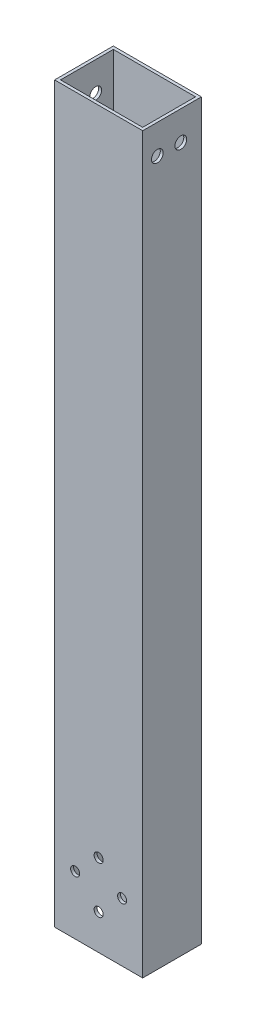
ISO-10303-21;
HEADER;
FILE_DESCRIPTION(('STEP AP214'),'2;1');
FILE_NAME('part.step','',(''),(''),'','','');
FILE_SCHEMA(('AUTOMOTIVE_DESIGN { 1 0 10303 214 1 1 1 1 }'));
ENDSEC;
DATA;
#1=APPLICATION_CONTEXT('core data for automotive mechanical design processes');
#2=APPLICATION_PROTOCOL_DEFINITION('international standard','automotive_design',2000,#1);
#3=PRODUCT_CONTEXT('',#1,'mechanical');
#4=PRODUCT('Part','Part','',(#3));
#5=PRODUCT_RELATED_PRODUCT_CATEGORY('part','',(#4));
#6=PRODUCT_DEFINITION_FORMATION('','',#4);
#7=PRODUCT_DEFINITION_CONTEXT('part definition',#1,'design');
#8=PRODUCT_DEFINITION('design','',#6,#7);
#9=PRODUCT_DEFINITION_SHAPE('','',#8);
#10=(LENGTH_UNIT() NAMED_UNIT(*) SI_UNIT(.MILLI.,.METRE.));
#11=(NAMED_UNIT(*) PLANE_ANGLE_UNIT() SI_UNIT($,.RADIAN.));
#12=(NAMED_UNIT(*) SI_UNIT($,.STERADIAN.) SOLID_ANGLE_UNIT());
#13=UNCERTAINTY_MEASURE_WITH_UNIT(LENGTH_MEASURE(1.E-05),#10,'distance_accuracy_value','');
#14=(GEOMETRIC_REPRESENTATION_CONTEXT(3) GLOBAL_UNCERTAINTY_ASSIGNED_CONTEXT((#13)) GLOBAL_UNIT_ASSIGNED_CONTEXT((#10,
#11,#12)) REPRESENTATION_CONTEXT('',''));
#15=CARTESIAN_POINT('',(0.,0.,0.));
#16=DIRECTION('',(0.,0.,1.));
#17=DIRECTION('',(1.,0.,0.));
#18=AXIS2_PLACEMENT_3D('',#15,#16,#17);
#19=CARTESIAN_POINT('',(0.,250.,0.));
#20=DIRECTION('',(0.,-1.,0.));
#21=DIRECTION('',(0.,0.,-1.));
#22=AXIS2_PLACEMENT_3D('',#19,#20,#21);
#23=PLANE('',#22);
#24=DIRECTION('',(0.,0.,-1.));
#25=VECTOR('',#24,1.);
#26=CARTESIAN_POINT('',(15.,250.,10.));
#27=LINE('',#26,#25);
#28=CARTESIAN_POINT('',(15.,250.,10.));
#29=VERTEX_POINT('',#28);
#30=CARTESIAN_POINT('',(15.,250.,-10.));
#31=VERTEX_POINT('',#30);
#32=EDGE_CURVE('E139',#29,#31,#27,.T.);
#33=ORIENTED_EDGE('',*,*,#32,.T.);
#34=DIRECTION('',(-1.,0.,0.));
#35=VECTOR('',#34,1.);
#36=CARTESIAN_POINT('',(-15.,250.,-10.));
#37=LINE('',#36,#35);
#38=CARTESIAN_POINT('',(-15.,250.,-10.));
#39=VERTEX_POINT('',#38);
#40=EDGE_CURVE('E142',#31,#39,#37,.T.);
#41=ORIENTED_EDGE('',*,*,#40,.T.);
#42=DIRECTION('',(0.,0.,1.));
#43=VECTOR('',#42,1.);
#44=CARTESIAN_POINT('',(-15.,250.,10.));
#45=LINE('',#44,#43);
#46=CARTESIAN_POINT('',(-15.,250.,10.));
#47=VERTEX_POINT('',#46);
#48=EDGE_CURVE('E145',#39,#47,#45,.T.);
#49=ORIENTED_EDGE('',*,*,#48,.T.);
#50=DIRECTION('',(1.,0.,0.));
#51=VECTOR('',#50,1.);
#52=CARTESIAN_POINT('',(-15.,250.,10.));
#53=LINE('',#52,#51);
#54=EDGE_CURVE('E147',#47,#29,#53,.T.);
#55=ORIENTED_EDGE('',*,*,#54,.T.);
#56=EDGE_LOOP('',(#33,#41,#49,#55));
#57=FACE_BOUND('',#56,.T.);
#58=DIRECTION('',(0.,0.,-1.));
#59=VECTOR('',#58,1.);
#60=CARTESIAN_POINT('',(14.,250.,9.00000000000001));
#61=LINE('',#60,#59);
#62=CARTESIAN_POINT('',(14.,250.,9.00000000000001));
#63=VERTEX_POINT('',#62);
#64=CARTESIAN_POINT('',(14.,250.,-9.00000000000001));
#65=VERTEX_POINT('',#64);
#66=EDGE_CURVE('E101',#63,#65,#61,.T.);
#67=ORIENTED_EDGE('',*,*,#66,.F.);
#68=DIRECTION('',(1.,0.,0.));
#69=VECTOR('',#68,1.);
#70=CARTESIAN_POINT('',(-14.,250.,9.00000000000001));
#71=LINE('',#70,#69);
#72=CARTESIAN_POINT('',(-14.,250.,9.00000000000001));
#73=VERTEX_POINT('',#72);
#74=EDGE_CURVE('E123',#73,#63,#71,.T.);
#75=ORIENTED_EDGE('',*,*,#74,.F.);
#76=DIRECTION('',(0.,0.,1.));
#77=VECTOR('',#76,1.);
#78=CARTESIAN_POINT('',(-14.,250.,9.00000000000001));
#79=LINE('',#78,#77);
#80=CARTESIAN_POINT('',(-14.,250.,-9.));
#81=VERTEX_POINT('',#80);
#82=EDGE_CURVE('E121',#81,#73,#79,.T.);
#83=ORIENTED_EDGE('',*,*,#82,.F.);
#84=DIRECTION('',(-1.,0.,0.));
#85=VECTOR('',#84,1.);
#86=CARTESIAN_POINT('',(-14.,250.,-9.));
#87=LINE('',#86,#85);
#88=EDGE_CURVE('E109',#65,#81,#87,.T.);
#89=ORIENTED_EDGE('',*,*,#88,.F.);
#90=EDGE_LOOP('',(#67,#75,#83,#89));
#91=FACE_BOUND('',#90,.T.);
#92=ADVANCED_FACE('F34',(#57,#91),#23,.F.);
#93=CARTESIAN_POINT('',(0.,0.,0.));
#94=DIRECTION('',(0.,-1.,0.));
#95=DIRECTION('',(0.,0.,-1.));
#96=AXIS2_PLACEMENT_3D('',#93,#94,#95);
#97=PLANE('',#96);
#98=DIRECTION('',(0.,0.,-1.));
#99=VECTOR('',#98,1.);
#100=CARTESIAN_POINT('',(15.,0.,10.));
#101=LINE('',#100,#99);
#102=CARTESIAN_POINT('',(15.,0.,10.));
#103=VERTEX_POINT('',#102);
#104=CARTESIAN_POINT('',(15.,0.,-10.));
#105=VERTEX_POINT('',#104);
#106=EDGE_CURVE('E117',#103,#105,#101,.T.);
#107=ORIENTED_EDGE('',*,*,#106,.F.);
#108=DIRECTION('',(1.,0.,0.));
#109=VECTOR('',#108,1.);
#110=CARTESIAN_POINT('',(-15.,0.,10.));
#111=LINE('',#110,#109);
#112=CARTESIAN_POINT('',(-15.,0.,10.));
#113=VERTEX_POINT('',#112);
#114=EDGE_CURVE('E143',#113,#103,#111,.T.);
#115=ORIENTED_EDGE('',*,*,#114,.F.);
#116=DIRECTION('',(0.,0.,1.));
#117=VECTOR('',#116,1.);
#118=CARTESIAN_POINT('',(-15.,0.,10.));
#119=LINE('',#118,#117);
#120=CARTESIAN_POINT('',(-15.,0.,-10.));
#121=VERTEX_POINT('',#120);
#122=EDGE_CURVE('E154',#121,#113,#119,.T.);
#123=ORIENTED_EDGE('',*,*,#122,.F.);
#124=DIRECTION('',(-1.,0.,0.));
#125=VECTOR('',#124,1.);
#126=CARTESIAN_POINT('',(-15.,0.,-10.));
#127=LINE('',#126,#125);
#128=EDGE_CURVE('E152',#105,#121,#127,.T.);
#129=ORIENTED_EDGE('',*,*,#128,.F.);
#130=EDGE_LOOP('',(#107,#115,#123,#129));
#131=FACE_BOUND('',#130,.T.);
#132=DIRECTION('',(1.,0.,0.));
#133=VECTOR('',#132,1.);
#134=CARTESIAN_POINT('',(-14.,0.,9.00000000000001));
#135=LINE('',#134,#133);
#136=CARTESIAN_POINT('',(-14.,0.,9.00000000000001));
#137=VERTEX_POINT('',#136);
#138=CARTESIAN_POINT('',(14.,0.,9.00000000000001));
#139=VERTEX_POINT('',#138);
#140=EDGE_CURVE('E110',#137,#139,#135,.T.);
#141=ORIENTED_EDGE('',*,*,#140,.T.);
#142=DIRECTION('',(0.,0.,-1.));
#143=VECTOR('',#142,1.);
#144=CARTESIAN_POINT('',(14.,0.,9.00000000000001));
#145=LINE('',#144,#143);
#146=CARTESIAN_POINT('',(14.,0.,-9.00000000000001));
#147=VERTEX_POINT('',#146);
#148=EDGE_CURVE('E59',#139,#147,#145,.T.);
#149=ORIENTED_EDGE('',*,*,#148,.T.);
#150=DIRECTION('',(-1.,0.,0.));
#151=VECTOR('',#150,1.);
#152=CARTESIAN_POINT('',(-14.,0.,-9.));
#153=LINE('',#152,#151);
#154=CARTESIAN_POINT('',(-14.,0.,-9.));
#155=VERTEX_POINT('',#154);
#156=EDGE_CURVE('E116',#147,#155,#153,.T.);
#157=ORIENTED_EDGE('',*,*,#156,.T.);
#158=DIRECTION('',(0.,0.,1.));
#159=VECTOR('',#158,1.);
#160=CARTESIAN_POINT('',(-14.,0.,9.00000000000001));
#161=LINE('',#160,#159);
#162=EDGE_CURVE('E131',#155,#137,#161,.T.);
#163=ORIENTED_EDGE('',*,*,#162,.T.);
#164=EDGE_LOOP('',(#141,#149,#157,#163));
#165=FACE_BOUND('',#164,.T.);
#166=ADVANCED_FACE('F271',(#131,#165),#97,.T.);
#167=CARTESIAN_POINT('',(15.,250.,10.));
#168=DIRECTION('',(-1.,0.,0.));
#169=DIRECTION('',(0.,0.,1.));
#170=AXIS2_PLACEMENT_3D('',#167,#168,#169);
#171=PLANE('',#170);
#172=CARTESIAN_POINT('',(15.,240.,5.));
#173=DIRECTION('',(1.,0.,0.));
#174=DIRECTION('',(0.,0.,-1.));
#175=AXIS2_PLACEMENT_3D('',#172,#173,#174);
#176=CIRCLE('',#175,2.);
#177=CARTESIAN_POINT('',(15.,240.,3.));
#178=VERTEX_POINT('',#177);
#179=EDGE_CURVE('E188',#178,#178,#176,.T.);
#180=ORIENTED_EDGE('',*,*,#179,.F.);
#181=EDGE_LOOP('',(#180));
#182=FACE_BOUND('',#181,.T.);
#183=CARTESIAN_POINT('',(15.,240.,-3.));
#184=DIRECTION('',(1.,0.,0.));
#185=DIRECTION('',(0.,0.,-1.));
#186=AXIS2_PLACEMENT_3D('',#183,#184,#185);
#187=CIRCLE('',#186,2.);
#188=CARTESIAN_POINT('',(15.,240.,-5.));
#189=VERTEX_POINT('',#188);
#190=EDGE_CURVE('E196',#189,#189,#187,.T.);
#191=ORIENTED_EDGE('',*,*,#190,.F.);
#192=EDGE_LOOP('',(#191));
#193=FACE_BOUND('',#192,.T.);
#194=ORIENTED_EDGE('',*,*,#106,.T.);
#195=DIRECTION('',(0.,-1.,0.));
#196=VECTOR('',#195,1.);
#197=CARTESIAN_POINT('',(15.,250.,-10.));
#198=LINE('',#197,#196);
#199=EDGE_CURVE('E11',#31,#105,#198,.T.);
#200=ORIENTED_EDGE('',*,*,#199,.F.);
#201=ORIENTED_EDGE('',*,*,#32,.F.);
#202=DIRECTION('',(0.,-1.,0.));
#203=VECTOR('',#202,1.);
#204=CARTESIAN_POINT('',(15.,250.,10.));
#205=LINE('',#204,#203);
#206=EDGE_CURVE('E149',#29,#103,#205,.T.);
#207=ORIENTED_EDGE('',*,*,#206,.T.);
#208=EDGE_LOOP('',(#194,#200,#201,#207));
#209=FACE_BOUND('',#208,.T.);
#210=ADVANCED_FACE('F36',(#182,#193,#209),#171,.F.);
#211=CARTESIAN_POINT('',(-15.,250.,-10.));
#212=DIRECTION('',(0.,0.,1.));
#213=DIRECTION('',(1.,0.,0.));
#214=AXIS2_PLACEMENT_3D('',#211,#212,#213);
#215=PLANE('',#214);
#216=CARTESIAN_POINT('',(1.26257310727977E-13,28.,-10.));
#217=DIRECTION('',(0.,0.,1.));
#218=DIRECTION('',(1.,0.,0.));
#219=AXIS2_PLACEMENT_3D('',#216,#217,#218);
#220=CIRCLE('',#219,1.54999999999989);
#221=CARTESIAN_POINT('',(1.55000000000002,28.,-10.));
#222=VERTEX_POINT('',#221);
#223=EDGE_CURVE('E168',#222,#222,#220,.T.);
#224=ORIENTED_EDGE('',*,*,#223,.T.);
#225=EDGE_LOOP('',(#224));
#226=FACE_BOUND('',#225,.T.);
#227=CARTESIAN_POINT('',(8.00000000000013,20.,-10.));
#228=DIRECTION('',(0.,0.,1.));
#229=DIRECTION('',(1.,0.,0.));
#230=AXIS2_PLACEMENT_3D('',#227,#228,#229);
#231=CIRCLE('',#230,1.55);
#232=CARTESIAN_POINT('',(9.55000000000013,20.,-10.));
#233=VERTEX_POINT('',#232);
#234=EDGE_CURVE('E208',#233,#233,#231,.T.);
#235=ORIENTED_EDGE('',*,*,#234,.T.);
#236=EDGE_LOOP('',(#235));
#237=FACE_BOUND('',#236,.T.);
#238=CARTESIAN_POINT('',(1.26257310727977E-13,12.,-10.));
#239=DIRECTION('',(0.,0.,1.));
#240=DIRECTION('',(1.,0.,0.));
#241=AXIS2_PLACEMENT_3D('',#238,#239,#240);
#242=CIRCLE('',#241,1.55000000000011);
#243=CARTESIAN_POINT('',(1.55000000000023,12.,-10.));
#244=VERTEX_POINT('',#243);
#245=EDGE_CURVE('E214',#244,#244,#242,.T.);
#246=ORIENTED_EDGE('',*,*,#245,.T.);
#247=EDGE_LOOP('',(#246));
#248=FACE_BOUND('',#247,.T.);
#249=CARTESIAN_POINT('',(-7.99999999999988,20.,-10.));
#250=DIRECTION('',(0.,0.,1.));
#251=DIRECTION('',(1.,0.,0.));
#252=AXIS2_PLACEMENT_3D('',#249,#250,#251);
#253=CIRCLE('',#252,1.55000000000001);
#254=CARTESIAN_POINT('',(-6.44999999999987,20.,-10.));
#255=VERTEX_POINT('',#254);
#256=EDGE_CURVE('E220',#255,#255,#253,.T.);
#257=ORIENTED_EDGE('',*,*,#256,.T.);
#258=EDGE_LOOP('',(#257));
#259=FACE_BOUND('',#258,.T.);
#260=ORIENTED_EDGE('',*,*,#128,.T.);
#261=DIRECTION('',(0.,-1.,0.));
#262=VECTOR('',#261,1.);
#263=CARTESIAN_POINT('',(-15.,250.,-10.));
#264=LINE('',#263,#262);
#265=EDGE_CURVE('E43',#39,#121,#264,.T.);
#266=ORIENTED_EDGE('',*,*,#265,.F.);
#267=ORIENTED_EDGE('',*,*,#40,.F.);
#268=ORIENTED_EDGE('',*,*,#199,.T.);
#269=EDGE_LOOP('',(#260,#266,#267,#268));
#270=FACE_BOUND('',#269,.T.);
#271=ADVANCED_FACE('F257',(#226,#237,#248,#259,#270),#215,.F.);
#272=CARTESIAN_POINT('',(-15.,250.,10.));
#273=DIRECTION('',(1.,0.,0.));
#274=DIRECTION('',(0.,0.,-1.));
#275=AXIS2_PLACEMENT_3D('',#272,#273,#274);
#276=PLANE('',#275);
#277=CARTESIAN_POINT('',(-15.,240.,5.));
#278=DIRECTION('',(1.,0.,0.));
#279=DIRECTION('',(0.,0.,-1.));
#280=AXIS2_PLACEMENT_3D('',#277,#278,#279);
#281=CIRCLE('',#280,2.);
#282=CARTESIAN_POINT('',(-15.,240.,3.));
#283=VERTEX_POINT('',#282);
#284=EDGE_CURVE('E182',#283,#283,#281,.T.);
#285=ORIENTED_EDGE('',*,*,#284,.T.);
#286=EDGE_LOOP('',(#285));
#287=FACE_BOUND('',#286,.T.);
#288=CARTESIAN_POINT('',(-15.,240.,-3.));
#289=DIRECTION('',(1.,0.,0.));
#290=DIRECTION('',(0.,0.,-1.));
#291=AXIS2_PLACEMENT_3D('',#288,#289,#290);
#292=CIRCLE('',#291,2.);
#293=CARTESIAN_POINT('',(-15.,240.,-5.));
#294=VERTEX_POINT('',#293);
#295=EDGE_CURVE('E193',#294,#294,#292,.T.);
#296=ORIENTED_EDGE('',*,*,#295,.T.);
#297=EDGE_LOOP('',(#296));
#298=FACE_BOUND('',#297,.T.);
#299=ORIENTED_EDGE('',*,*,#122,.T.);
#300=DIRECTION('',(0.,-1.,0.));
#301=VECTOR('',#300,1.);
#302=CARTESIAN_POINT('',(-15.,250.,10.));
#303=LINE('',#302,#301);
#304=EDGE_CURVE('E159',#47,#113,#303,.T.);
#305=ORIENTED_EDGE('',*,*,#304,.F.);
#306=ORIENTED_EDGE('',*,*,#48,.F.);
#307=ORIENTED_EDGE('',*,*,#265,.T.);
#308=EDGE_LOOP('',(#299,#305,#306,#307));
#309=FACE_BOUND('',#308,.T.);
#310=ADVANCED_FACE('F260',(#287,#298,#309),#276,.F.);
#311=CARTESIAN_POINT('',(-15.,250.,10.));
#312=DIRECTION('',(0.,0.,-1.));
#313=DIRECTION('',(-1.,0.,0.));
#314=AXIS2_PLACEMENT_3D('',#311,#312,#313);
#315=PLANE('',#314);
#316=CARTESIAN_POINT('',(1.26257310727977E-13,28.,10.));
#317=DIRECTION('',(0.,0.,1.));
#318=DIRECTION('',(1.,0.,0.));
#319=AXIS2_PLACEMENT_3D('',#316,#317,#318);
#320=CIRCLE('',#319,1.54999999999989);
#321=CARTESIAN_POINT('',(1.55000000000002,28.,10.));
#322=VERTEX_POINT('',#321);
#323=EDGE_CURVE('E205',#322,#322,#320,.T.);
#324=ORIENTED_EDGE('',*,*,#323,.F.);
#325=EDGE_LOOP('',(#324));
#326=FACE_BOUND('',#325,.T.);
#327=CARTESIAN_POINT('',(8.00000000000013,20.,10.));
#328=DIRECTION('',(0.,0.,1.));
#329=DIRECTION('',(1.,0.,0.));
#330=AXIS2_PLACEMENT_3D('',#327,#328,#329);
#331=CIRCLE('',#330,1.55);
#332=CARTESIAN_POINT('',(9.55000000000013,20.,10.));
#333=VERTEX_POINT('',#332);
#334=EDGE_CURVE('E211',#333,#333,#331,.T.);
#335=ORIENTED_EDGE('',*,*,#334,.F.);
#336=EDGE_LOOP('',(#335));
#337=FACE_BOUND('',#336,.T.);
#338=CARTESIAN_POINT('',(1.26257310727977E-13,12.,10.));
#339=DIRECTION('',(0.,0.,1.));
#340=DIRECTION('',(1.,0.,0.));
#341=AXIS2_PLACEMENT_3D('',#338,#339,#340);
#342=CIRCLE('',#341,1.55000000000011);
#343=CARTESIAN_POINT('',(1.55000000000023,12.,10.));
#344=VERTEX_POINT('',#343);
#345=EDGE_CURVE('E217',#344,#344,#342,.T.);
#346=ORIENTED_EDGE('',*,*,#345,.F.);
#347=EDGE_LOOP('',(#346));
#348=FACE_BOUND('',#347,.T.);
#349=CARTESIAN_POINT('',(-7.99999999999988,20.,10.));
#350=DIRECTION('',(0.,0.,1.));
#351=DIRECTION('',(1.,0.,0.));
#352=AXIS2_PLACEMENT_3D('',#349,#350,#351);
#353=CIRCLE('',#352,1.55000000000001);
#354=CARTESIAN_POINT('',(-6.44999999999987,20.,10.));
#355=VERTEX_POINT('',#354);
#356=EDGE_CURVE('E204',#355,#355,#353,.T.);
#357=ORIENTED_EDGE('',*,*,#356,.F.);
#358=EDGE_LOOP('',(#357));
#359=FACE_BOUND('',#358,.T.);
#360=ORIENTED_EDGE('',*,*,#114,.T.);
#361=ORIENTED_EDGE('',*,*,#206,.F.);
#362=ORIENTED_EDGE('',*,*,#54,.F.);
#363=ORIENTED_EDGE('',*,*,#304,.T.);
#364=EDGE_LOOP('',(#360,#361,#362,#363));
#365=FACE_BOUND('',#364,.T.);
#366=ADVANCED_FACE('F275',(#326,#337,#348,#359,#365),#315,.F.);
#367=CARTESIAN_POINT('',(14.,250.,9.00000000000001));
#368=DIRECTION('',(-1.,0.,0.));
#369=DIRECTION('',(0.,0.,1.));
#370=AXIS2_PLACEMENT_3D('',#367,#368,#369);
#371=PLANE('',#370);
#372=CARTESIAN_POINT('',(14.,240.,5.));
#373=DIRECTION('',(-1.,0.,0.));
#374=DIRECTION('',(0.,0.,1.));
#375=AXIS2_PLACEMENT_3D('',#372,#373,#374);
#376=CIRCLE('',#375,2.);
#377=CARTESIAN_POINT('',(14.,240.,7.00000000000001));
#378=VERTEX_POINT('',#377);
#379=EDGE_CURVE('E201',#378,#378,#376,.T.);
#380=ORIENTED_EDGE('',*,*,#379,.F.);
#381=EDGE_LOOP('',(#380));
#382=FACE_BOUND('',#381,.T.);
#383=CARTESIAN_POINT('',(14.,240.,-3.));
#384=DIRECTION('',(-1.,0.,0.));
#385=DIRECTION('',(0.,0.,1.));
#386=AXIS2_PLACEMENT_3D('',#383,#384,#385);
#387=CIRCLE('',#386,2.);
#388=CARTESIAN_POINT('',(14.,240.,-0.999999999999999));
#389=VERTEX_POINT('',#388);
#390=EDGE_CURVE('E181',#389,#389,#387,.T.);
#391=ORIENTED_EDGE('',*,*,#390,.F.);
#392=EDGE_LOOP('',(#391));
#393=FACE_BOUND('',#392,.T.);
#394=ORIENTED_EDGE('',*,*,#148,.F.);
#395=DIRECTION('',(0.,-1.,0.));
#396=VECTOR('',#395,1.);
#397=CARTESIAN_POINT('',(14.,250.,9.00000000000001));
#398=LINE('',#397,#396);
#399=EDGE_CURVE('E105',#63,#139,#398,.T.);
#400=ORIENTED_EDGE('',*,*,#399,.F.);
#401=ORIENTED_EDGE('',*,*,#66,.T.);
#402=DIRECTION('',(0.,-1.,0.));
#403=VECTOR('',#402,1.);
#404=CARTESIAN_POINT('',(14.,250.,-9.00000000000001));
#405=LINE('',#404,#403);
#406=EDGE_CURVE('E104',#65,#147,#405,.T.);
#407=ORIENTED_EDGE('',*,*,#406,.T.);
#408=EDGE_LOOP('',(#394,#400,#401,#407));
#409=FACE_BOUND('',#408,.T.);
#410=ADVANCED_FACE('F103',(#382,#393,#409),#371,.T.);
#411=CARTESIAN_POINT('',(-14.,250.,-9.));
#412=DIRECTION('',(0.,0.,1.));
#413=DIRECTION('',(1.,0.,0.));
#414=AXIS2_PLACEMENT_3D('',#411,#412,#413);
#415=PLANE('',#414);
#416=CARTESIAN_POINT('',(1.26257310727977E-13,28.,-9.00000000000001));
#417=DIRECTION('',(0.,0.,1.));
#418=DIRECTION('',(1.,0.,0.));
#419=AXIS2_PLACEMENT_3D('',#416,#417,#418);
#420=CIRCLE('',#419,1.54999999999989);
#421=CARTESIAN_POINT('',(1.55000000000002,28.,-9.00000000000001));
#422=VERTEX_POINT('',#421);
#423=EDGE_CURVE('E129',#422,#422,#420,.T.);
#424=ORIENTED_EDGE('',*,*,#423,.F.);
#425=EDGE_LOOP('',(#424));
#426=FACE_BOUND('',#425,.T.);
#427=CARTESIAN_POINT('',(8.00000000000013,20.,-9.00000000000001));
#428=DIRECTION('',(0.,0.,1.));
#429=DIRECTION('',(1.,0.,0.));
#430=AXIS2_PLACEMENT_3D('',#427,#428,#429);
#431=CIRCLE('',#430,1.55);
#432=CARTESIAN_POINT('',(9.55000000000013,20.,-9.00000000000001));
#433=VERTEX_POINT('',#432);
#434=EDGE_CURVE('E176',#433,#433,#431,.T.);
#435=ORIENTED_EDGE('',*,*,#434,.F.);
#436=EDGE_LOOP('',(#435));
#437=FACE_BOUND('',#436,.T.);
#438=CARTESIAN_POINT('',(1.26257310727977E-13,12.,-9.00000000000001));
#439=DIRECTION('',(0.,0.,1.));
#440=DIRECTION('',(1.,0.,0.));
#441=AXIS2_PLACEMENT_3D('',#438,#439,#440);
#442=CIRCLE('',#441,1.55000000000011);
#443=CARTESIAN_POINT('',(1.55000000000023,12.,-9.00000000000001));
#444=VERTEX_POINT('',#443);
#445=EDGE_CURVE('E172',#444,#444,#442,.T.);
#446=ORIENTED_EDGE('',*,*,#445,.F.);
#447=EDGE_LOOP('',(#446));
#448=FACE_BOUND('',#447,.T.);
#449=CARTESIAN_POINT('',(-7.99999999999988,20.,-9.));
#450=DIRECTION('',(0.,0.,1.));
#451=DIRECTION('',(1.,0.,0.));
#452=AXIS2_PLACEMENT_3D('',#449,#450,#451);
#453=CIRCLE('',#452,1.55000000000001);
#454=CARTESIAN_POINT('',(-6.44999999999987,20.,-9.));
#455=VERTEX_POINT('',#454);
#456=EDGE_CURVE('E167',#455,#455,#453,.T.);
#457=ORIENTED_EDGE('',*,*,#456,.F.);
#458=EDGE_LOOP('',(#457));
#459=FACE_BOUND('',#458,.T.);
#460=ORIENTED_EDGE('',*,*,#156,.F.);
#461=ORIENTED_EDGE('',*,*,#406,.F.);
#462=ORIENTED_EDGE('',*,*,#88,.T.);
#463=DIRECTION('',(0.,-1.,0.));
#464=VECTOR('',#463,1.);
#465=CARTESIAN_POINT('',(-14.,250.,-9.));
#466=LINE('',#465,#464);
#467=EDGE_CURVE('E118',#81,#155,#466,.T.);
#468=ORIENTED_EDGE('',*,*,#467,.T.);
#469=EDGE_LOOP('',(#460,#461,#462,#468));
#470=FACE_BOUND('',#469,.T.);
#471=ADVANCED_FACE('F113',(#426,#437,#448,#459,#470),#415,.T.);
#472=CARTESIAN_POINT('',(-14.,250.,9.00000000000001));
#473=DIRECTION('',(1.,0.,0.));
#474=DIRECTION('',(0.,0.,-1.));
#475=AXIS2_PLACEMENT_3D('',#472,#473,#474);
#476=PLANE('',#475);
#477=CARTESIAN_POINT('',(-14.,240.,5.));
#478=DIRECTION('',(1.,0.,0.));
#479=DIRECTION('',(0.,0.,-1.));
#480=AXIS2_PLACEMENT_3D('',#477,#478,#479);
#481=CIRCLE('',#480,2.);
#482=CARTESIAN_POINT('',(-14.,240.,3.));
#483=VERTEX_POINT('',#482);
#484=EDGE_CURVE('E38',#483,#483,#481,.T.);
#485=ORIENTED_EDGE('',*,*,#484,.F.);
#486=EDGE_LOOP('',(#485));
#487=FACE_BOUND('',#486,.T.);
#488=CARTESIAN_POINT('',(-14.,240.,-3.));
#489=DIRECTION('',(1.,0.,0.));
#490=DIRECTION('',(0.,0.,-1.));
#491=AXIS2_PLACEMENT_3D('',#488,#489,#490);
#492=CIRCLE('',#491,2.);
#493=CARTESIAN_POINT('',(-14.,240.,-5.));
#494=VERTEX_POINT('',#493);
#495=EDGE_CURVE('E179',#494,#494,#492,.T.);
#496=ORIENTED_EDGE('',*,*,#495,.F.);
#497=EDGE_LOOP('',(#496));
#498=FACE_BOUND('',#497,.T.);
#499=ORIENTED_EDGE('',*,*,#162,.F.);
#500=ORIENTED_EDGE('',*,*,#467,.F.);
#501=ORIENTED_EDGE('',*,*,#82,.T.);
#502=DIRECTION('',(0.,-1.,0.));
#503=VECTOR('',#502,1.);
#504=CARTESIAN_POINT('',(-14.,250.,9.00000000000001));
#505=LINE('',#504,#503);
#506=EDGE_CURVE('E51',#73,#137,#505,.T.);
#507=ORIENTED_EDGE('',*,*,#506,.T.);
#508=EDGE_LOOP('',(#499,#500,#501,#507));
#509=FACE_BOUND('',#508,.T.);
#510=ADVANCED_FACE('F240',(#487,#498,#509),#476,.T.);
#511=CARTESIAN_POINT('',(-14.,250.,9.00000000000001));
#512=DIRECTION('',(0.,0.,-1.));
#513=DIRECTION('',(-1.,0.,0.));
#514=AXIS2_PLACEMENT_3D('',#511,#512,#513);
#515=PLANE('',#514);
#516=CARTESIAN_POINT('',(1.26257310727977E-13,28.,9.00000000000001));
#517=DIRECTION('',(0.,0.,-1.));
#518=DIRECTION('',(-1.,0.,0.));
#519=AXIS2_PLACEMENT_3D('',#516,#517,#518);
#520=CIRCLE('',#519,1.54999999999989);
#521=CARTESIAN_POINT('',(-1.54999999999977,28.,9.00000000000001));
#522=VERTEX_POINT('',#521);
#523=EDGE_CURVE('E177',#522,#522,#520,.T.);
#524=ORIENTED_EDGE('',*,*,#523,.F.);
#525=EDGE_LOOP('',(#524));
#526=FACE_BOUND('',#525,.T.);
#527=CARTESIAN_POINT('',(8.00000000000013,20.,9.00000000000001));
#528=DIRECTION('',(0.,0.,-1.));
#529=DIRECTION('',(-1.,0.,0.));
#530=AXIS2_PLACEMENT_3D('',#527,#528,#529);
#531=CIRCLE('',#530,1.55);
#532=CARTESIAN_POINT('',(6.45000000000013,20.,9.00000000000001));
#533=VERTEX_POINT('',#532);
#534=EDGE_CURVE('E173',#533,#533,#531,.T.);
#535=ORIENTED_EDGE('',*,*,#534,.F.);
#536=EDGE_LOOP('',(#535));
#537=FACE_BOUND('',#536,.T.);
#538=CARTESIAN_POINT('',(1.26257310727977E-13,12.,9.00000000000001));
#539=DIRECTION('',(0.,0.,-1.));
#540=DIRECTION('',(-1.,0.,0.));
#541=AXIS2_PLACEMENT_3D('',#538,#539,#540);
#542=CIRCLE('',#541,1.55000000000011);
#543=CARTESIAN_POINT('',(-1.54999999999998,12.,9.00000000000001));
#544=VERTEX_POINT('',#543);
#545=EDGE_CURVE('E169',#544,#544,#542,.T.);
#546=ORIENTED_EDGE('',*,*,#545,.F.);
#547=EDGE_LOOP('',(#546));
#548=FACE_BOUND('',#547,.T.);
#549=CARTESIAN_POINT('',(-7.99999999999988,20.,9.00000000000001));
#550=DIRECTION('',(0.,0.,-1.));
#551=DIRECTION('',(-1.,0.,0.));
#552=AXIS2_PLACEMENT_3D('',#549,#550,#551);
#553=CIRCLE('',#552,1.55000000000001);
#554=CARTESIAN_POINT('',(-9.54999999999988,20.,9.00000000000001));
#555=VERTEX_POINT('',#554);
#556=EDGE_CURVE('E164',#555,#555,#553,.T.);
#557=ORIENTED_EDGE('',*,*,#556,.F.);
#558=EDGE_LOOP('',(#557));
#559=FACE_BOUND('',#558,.T.);
#560=ORIENTED_EDGE('',*,*,#140,.F.);
#561=ORIENTED_EDGE('',*,*,#506,.F.);
#562=ORIENTED_EDGE('',*,*,#74,.T.);
#563=ORIENTED_EDGE('',*,*,#399,.T.);
#564=EDGE_LOOP('',(#560,#561,#562,#563));
#565=FACE_BOUND('',#564,.T.);
#566=ADVANCED_FACE('F358',(#526,#537,#548,#559,#565),#515,.T.);
#567=CARTESIAN_POINT('',(-7.99999999999988,20.,-10.));
#568=DIRECTION('',(0.,0.,1.));
#569=DIRECTION('',(1.,0.,0.));
#570=AXIS2_PLACEMENT_3D('',#567,#568,#569);
#571=CYLINDRICAL_SURFACE('',#570,1.55000000000001);
#572=ORIENTED_EDGE('',*,*,#556,.T.);
#573=EDGE_LOOP('',(#572));
#574=FACE_BOUND('',#573,.T.);
#575=ORIENTED_EDGE('',*,*,#356,.T.);
#576=EDGE_LOOP('',(#575));
#577=FACE_BOUND('',#576,.T.);
#578=ADVANCED_FACE('F254',(#574,#577),#571,.F.);
#579=CARTESIAN_POINT('',(1.26257310727977E-13,12.,-10.));
#580=DIRECTION('',(0.,0.,1.));
#581=DIRECTION('',(1.,0.,0.));
#582=AXIS2_PLACEMENT_3D('',#579,#580,#581);
#583=CYLINDRICAL_SURFACE('',#582,1.55000000000011);
#584=ORIENTED_EDGE('',*,*,#545,.T.);
#585=EDGE_LOOP('',(#584));
#586=FACE_BOUND('',#585,.T.);
#587=ORIENTED_EDGE('',*,*,#345,.T.);
#588=EDGE_LOOP('',(#587));
#589=FACE_BOUND('',#588,.T.);
#590=ADVANCED_FACE('F372',(#586,#589),#583,.F.);
#591=CARTESIAN_POINT('',(8.00000000000013,20.,-10.));
#592=DIRECTION('',(0.,0.,1.));
#593=DIRECTION('',(1.,0.,0.));
#594=AXIS2_PLACEMENT_3D('',#591,#592,#593);
#595=CYLINDRICAL_SURFACE('',#594,1.55);
#596=ORIENTED_EDGE('',*,*,#534,.T.);
#597=EDGE_LOOP('',(#596));
#598=FACE_BOUND('',#597,.T.);
#599=ORIENTED_EDGE('',*,*,#334,.T.);
#600=EDGE_LOOP('',(#599));
#601=FACE_BOUND('',#600,.T.);
#602=ADVANCED_FACE('F381',(#598,#601),#595,.F.);
#603=CARTESIAN_POINT('',(1.26257310727977E-13,28.,-10.));
#604=DIRECTION('',(0.,0.,1.));
#605=DIRECTION('',(1.,0.,0.));
#606=AXIS2_PLACEMENT_3D('',#603,#604,#605);
#607=CYLINDRICAL_SURFACE('',#606,1.54999999999989);
#608=ORIENTED_EDGE('',*,*,#523,.T.);
#609=EDGE_LOOP('',(#608));
#610=FACE_BOUND('',#609,.T.);
#611=ORIENTED_EDGE('',*,*,#323,.T.);
#612=EDGE_LOOP('',(#611));
#613=FACE_BOUND('',#612,.T.);
#614=ADVANCED_FACE('F252',(#610,#613),#607,.F.);
#615=ORIENTED_EDGE('',*,*,#456,.T.);
#616=EDGE_LOOP('',(#615));
#617=FACE_BOUND('',#616,.T.);
#618=ORIENTED_EDGE('',*,*,#256,.F.);
#619=EDGE_LOOP('',(#618));
#620=FACE_BOUND('',#619,.T.);
#621=ADVANCED_FACE('F248',(#617,#620),#571,.F.);
#622=ORIENTED_EDGE('',*,*,#445,.T.);
#623=EDGE_LOOP('',(#622));
#624=FACE_BOUND('',#623,.T.);
#625=ORIENTED_EDGE('',*,*,#245,.F.);
#626=EDGE_LOOP('',(#625));
#627=FACE_BOUND('',#626,.T.);
#628=ADVANCED_FACE('F251',(#624,#627),#583,.F.);
#629=ORIENTED_EDGE('',*,*,#434,.T.);
#630=EDGE_LOOP('',(#629));
#631=FACE_BOUND('',#630,.T.);
#632=ORIENTED_EDGE('',*,*,#234,.F.);
#633=EDGE_LOOP('',(#632));
#634=FACE_BOUND('',#633,.T.);
#635=ADVANCED_FACE('F309',(#631,#634),#595,.F.);
#636=ORIENTED_EDGE('',*,*,#423,.T.);
#637=EDGE_LOOP('',(#636));
#638=FACE_BOUND('',#637,.T.);
#639=ORIENTED_EDGE('',*,*,#223,.F.);
#640=EDGE_LOOP('',(#639));
#641=FACE_BOUND('',#640,.T.);
#642=ADVANCED_FACE('F235',(#638,#641),#607,.F.);
#643=CARTESIAN_POINT('',(-15.,240.,-3.));
#644=DIRECTION('',(1.,0.,0.));
#645=DIRECTION('',(0.,0.,-1.));
#646=AXIS2_PLACEMENT_3D('',#643,#644,#645);
#647=CYLINDRICAL_SURFACE('',#646,2.);
#648=ORIENTED_EDGE('',*,*,#495,.T.);
#649=EDGE_LOOP('',(#648));
#650=FACE_BOUND('',#649,.T.);
#651=ORIENTED_EDGE('',*,*,#295,.F.);
#652=EDGE_LOOP('',(#651));
#653=FACE_BOUND('',#652,.T.);
#654=ADVANCED_FACE('F297',(#650,#653),#647,.F.);
#655=CARTESIAN_POINT('',(-15.,240.,5.));
#656=DIRECTION('',(1.,0.,0.));
#657=DIRECTION('',(0.,0.,-1.));
#658=AXIS2_PLACEMENT_3D('',#655,#656,#657);
#659=CYLINDRICAL_SURFACE('',#658,2.);
#660=ORIENTED_EDGE('',*,*,#484,.T.);
#661=EDGE_LOOP('',(#660));
#662=FACE_BOUND('',#661,.T.);
#663=ORIENTED_EDGE('',*,*,#284,.F.);
#664=EDGE_LOOP('',(#663));
#665=FACE_BOUND('',#664,.T.);
#666=ADVANCED_FACE('F299',(#662,#665),#659,.F.);
#667=ORIENTED_EDGE('',*,*,#390,.T.);
#668=EDGE_LOOP('',(#667));
#669=FACE_BOUND('',#668,.T.);
#670=ORIENTED_EDGE('',*,*,#190,.T.);
#671=EDGE_LOOP('',(#670));
#672=FACE_BOUND('',#671,.T.);
#673=ADVANCED_FACE('F301',(#669,#672),#647,.F.);
#674=ORIENTED_EDGE('',*,*,#379,.T.);
#675=EDGE_LOOP('',(#674));
#676=FACE_BOUND('',#675,.T.);
#677=ORIENTED_EDGE('',*,*,#179,.T.);
#678=EDGE_LOOP('',(#677));
#679=FACE_BOUND('',#678,.T.);
#680=ADVANCED_FACE('F308',(#676,#679),#659,.F.);
#681=CLOSED_SHELL('',(#92,#166,#210,#271,#310,#366,#410,#471,#510,#566,#578,#590,#602,#614,#621,
#628,#635,#642,#654,#666,#673,#680));
#682=MANIFOLD_SOLID_BREP('B2',#681);
#683=ADVANCED_BREP_SHAPE_REPRESENTATION('',(#18,#682),#14);
#684=SHAPE_DEFINITION_REPRESENTATION(#9,#683);
ENDSEC;
END-ISO-10303-21;
